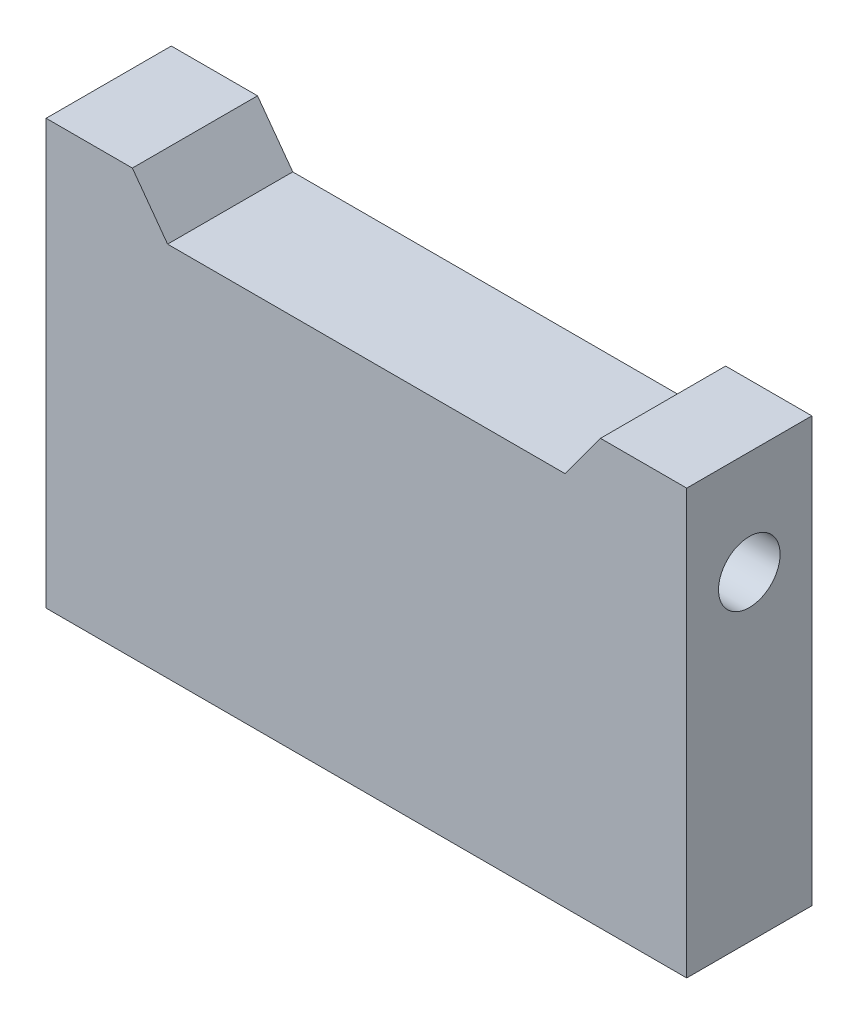
ISO-10303-21;
HEADER;
FILE_DESCRIPTION(('STEP AP214'),'2;1');
FILE_NAME('part.step','',(''),(''),'','','');
FILE_SCHEMA(('AUTOMOTIVE_DESIGN { 1 0 10303 214 1 1 1 1 }'));
ENDSEC;
DATA;
#1=APPLICATION_CONTEXT('core data for automotive mechanical design processes');
#2=APPLICATION_PROTOCOL_DEFINITION('international standard','automotive_design',2000,#1);
#3=PRODUCT_CONTEXT('',#1,'mechanical');
#4=PRODUCT('Part','Part','',(#3));
#5=PRODUCT_RELATED_PRODUCT_CATEGORY('part','',(#4));
#6=PRODUCT_DEFINITION_FORMATION('','',#4);
#7=PRODUCT_DEFINITION_CONTEXT('part definition',#1,'design');
#8=PRODUCT_DEFINITION('design','',#6,#7);
#9=PRODUCT_DEFINITION_SHAPE('','',#8);
#10=(LENGTH_UNIT() NAMED_UNIT(*) SI_UNIT(.MILLI.,.METRE.));
#11=(NAMED_UNIT(*) PLANE_ANGLE_UNIT() SI_UNIT($,.RADIAN.));
#12=(NAMED_UNIT(*) SI_UNIT($,.STERADIAN.) SOLID_ANGLE_UNIT());
#13=UNCERTAINTY_MEASURE_WITH_UNIT(LENGTH_MEASURE(1.E-05),#10,'distance_accuracy_value','');
#14=(GEOMETRIC_REPRESENTATION_CONTEXT(3) GLOBAL_UNCERTAINTY_ASSIGNED_CONTEXT((#13)) GLOBAL_UNIT_ASSIGNED_CONTEXT((#10,
#11,#12)) REPRESENTATION_CONTEXT('',''));
#15=CARTESIAN_POINT('',(0.,0.,0.));
#16=DIRECTION('',(0.,0.,1.));
#17=DIRECTION('',(1.,0.,0.));
#18=AXIS2_PLACEMENT_3D('',#15,#16,#17);
#19=CARTESIAN_POINT('',(-13.,8.61,-5.08));
#20=DIRECTION('',(0.,1.,0.));
#21=DIRECTION('',(0.,0.,1.));
#22=AXIS2_PLACEMENT_3D('',#19,#20,#21);
#23=PLANE('',#22);
#24=DIRECTION('',(0.,0.,1.));
#25=VECTOR('',#24,1.);
#26=CARTESIAN_POINT('',(-9.49999999999999,8.60999999999999,-5.08));
#27=LINE('',#26,#25);
#28=CARTESIAN_POINT('',(-9.49999999999999,8.60999999999999,-5.08));
#29=VERTEX_POINT('',#28);
#30=CARTESIAN_POINT('',(-9.49999999999999,8.60999999999999,0.));
#31=VERTEX_POINT('',#30);
#32=EDGE_CURVE('E170',#29,#31,#27,.T.);
#33=ORIENTED_EDGE('',*,*,#32,.F.);
#34=DIRECTION('',(-1.,0.,0.));
#35=VECTOR('',#34,1.);
#36=CARTESIAN_POINT('',(-13.,8.61,-5.08));
#37=LINE('',#36,#35);
#38=CARTESIAN_POINT('',(-13.,8.61,-5.08));
#39=VERTEX_POINT('',#38);
#40=EDGE_CURVE('E181',#29,#39,#37,.T.);
#41=ORIENTED_EDGE('',*,*,#40,.T.);
#42=DIRECTION('',(0.,0.,1.));
#43=VECTOR('',#42,1.);
#44=CARTESIAN_POINT('',(-13.,8.61,-5.08));
#45=LINE('',#44,#43);
#46=CARTESIAN_POINT('',(-13.,8.61,0.));
#47=VERTEX_POINT('',#46);
#48=EDGE_CURVE('E201',#39,#47,#45,.T.);
#49=ORIENTED_EDGE('',*,*,#48,.T.);
#50=DIRECTION('',(-1.,0.,0.));
#51=VECTOR('',#50,1.);
#52=CARTESIAN_POINT('',(-13.,8.61,0.));
#53=LINE('',#52,#51);
#54=EDGE_CURVE('E192',#31,#47,#53,.T.);
#55=ORIENTED_EDGE('',*,*,#54,.F.);
#56=EDGE_LOOP('',(#33,#41,#49,#55));
#57=FACE_BOUND('',#56,.T.);
#58=ADVANCED_FACE('F38',(#57),#23,.T.);
#59=CARTESIAN_POINT('',(13.,-8.61,-5.08));
#60=DIRECTION('',(1.,0.,0.));
#61=DIRECTION('',(0.,0.,-1.));
#62=AXIS2_PLACEMENT_3D('',#59,#60,#61);
#63=PLANE('',#62);
#64=CARTESIAN_POINT('',(13.,4.39,-2.54));
#65=DIRECTION('',(1.,0.,0.));
#66=DIRECTION('',(0.,0.,-1.));
#67=AXIS2_PLACEMENT_3D('',#64,#65,#66);
#68=CIRCLE('',#67,1.24999999999999);
#69=CARTESIAN_POINT('',(13.,4.39,-3.78999999999999));
#70=VERTEX_POINT('',#69);
#71=EDGE_CURVE('E132',#70,#70,#68,.T.);
#72=ORIENTED_EDGE('',*,*,#71,.F.);
#73=EDGE_LOOP('',(#72));
#74=FACE_BOUND('',#73,.T.);
#75=DIRECTION('',(0.,1.,0.));
#76=VECTOR('',#75,1.);
#77=CARTESIAN_POINT('',(13.,-8.61,0.));
#78=LINE('',#77,#76);
#79=CARTESIAN_POINT('',(13.,-8.61,0.));
#80=VERTEX_POINT('',#79);
#81=CARTESIAN_POINT('',(13.,8.61,0.));
#82=VERTEX_POINT('',#81);
#83=EDGE_CURVE('E172',#80,#82,#78,.T.);
#84=ORIENTED_EDGE('',*,*,#83,.F.);
#85=DIRECTION('',(0.,0.,1.));
#86=VECTOR('',#85,1.);
#87=CARTESIAN_POINT('',(13.,-8.61,-5.08));
#88=LINE('',#87,#86);
#89=CARTESIAN_POINT('',(13.,-8.61,-5.08));
#90=VERTEX_POINT('',#89);
#91=EDGE_CURVE('E11',#90,#80,#88,.T.);
#92=ORIENTED_EDGE('',*,*,#91,.F.);
#93=DIRECTION('',(0.,1.,0.));
#94=VECTOR('',#93,1.);
#95=CARTESIAN_POINT('',(13.,-8.61,-5.08));
#96=LINE('',#95,#94);
#97=CARTESIAN_POINT('',(13.,8.61,-5.08));
#98=VERTEX_POINT('',#97);
#99=EDGE_CURVE('E179',#90,#98,#96,.T.);
#100=ORIENTED_EDGE('',*,*,#99,.T.);
#101=DIRECTION('',(0.,0.,1.));
#102=VECTOR('',#101,1.);
#103=CARTESIAN_POINT('',(13.,8.61,-5.08));
#104=LINE('',#103,#102);
#105=EDGE_CURVE('E42',#98,#82,#104,.T.);
#106=ORIENTED_EDGE('',*,*,#105,.T.);
#107=EDGE_LOOP('',(#84,#92,#100,#106));
#108=FACE_BOUND('',#107,.T.);
#109=ADVANCED_FACE('F40',(#74,#108),#63,.T.);
#110=CARTESIAN_POINT('',(-13.,-8.61,-5.08));
#111=DIRECTION('',(0.,-1.,0.));
#112=DIRECTION('',(0.,0.,-1.));
#113=AXIS2_PLACEMENT_3D('',#110,#111,#112);
#114=PLANE('',#113);
#115=CARTESIAN_POINT('',(-10.,-8.61,-2.54));
#116=DIRECTION('',(0.,-1.,0.));
#117=DIRECTION('',(0.,0.,-1.));
#118=AXIS2_PLACEMENT_3D('',#115,#116,#117);
#119=CIRCLE('',#118,1.24999999999999);
#120=CARTESIAN_POINT('',(-10.,-8.61,-3.78999999999999));
#121=VERTEX_POINT('',#120);
#122=EDGE_CURVE('E142',#121,#121,#119,.T.);
#123=ORIENTED_EDGE('',*,*,#122,.F.);
#124=EDGE_LOOP('',(#123));
#125=FACE_BOUND('',#124,.T.);
#126=CARTESIAN_POINT('',(10.,-8.61,-2.54));
#127=DIRECTION('',(0.,-1.,0.));
#128=DIRECTION('',(0.,0.,-1.));
#129=AXIS2_PLACEMENT_3D('',#126,#127,#128);
#130=CIRCLE('',#129,1.24999999999999);
#131=CARTESIAN_POINT('',(10.,-8.61,-3.78999999999999));
#132=VERTEX_POINT('',#131);
#133=EDGE_CURVE('E148',#132,#132,#130,.T.);
#134=ORIENTED_EDGE('',*,*,#133,.F.);
#135=EDGE_LOOP('',(#134));
#136=FACE_BOUND('',#135,.T.);
#137=DIRECTION('',(1.,0.,0.));
#138=VECTOR('',#137,1.);
#139=CARTESIAN_POINT('',(-13.,-8.61,0.));
#140=LINE('',#139,#138);
#141=CARTESIAN_POINT('',(-13.,-8.61,0.));
#142=VERTEX_POINT('',#141);
#143=EDGE_CURVE('E182',#142,#80,#140,.T.);
#144=ORIENTED_EDGE('',*,*,#143,.F.);
#145=DIRECTION('',(0.,0.,1.));
#146=VECTOR('',#145,1.);
#147=CARTESIAN_POINT('',(-13.,-8.61,-5.08));
#148=LINE('',#147,#146);
#149=CARTESIAN_POINT('',(-13.,-8.61,-5.08));
#150=VERTEX_POINT('',#149);
#151=EDGE_CURVE('E47',#150,#142,#148,.T.);
#152=ORIENTED_EDGE('',*,*,#151,.F.);
#153=DIRECTION('',(1.,0.,0.));
#154=VECTOR('',#153,1.);
#155=CARTESIAN_POINT('',(-13.,-8.61,-5.08));
#156=LINE('',#155,#154);
#157=EDGE_CURVE('E188',#150,#90,#156,.T.);
#158=ORIENTED_EDGE('',*,*,#157,.T.);
#159=ORIENTED_EDGE('',*,*,#91,.T.);
#160=EDGE_LOOP('',(#144,#152,#158,#159));
#161=FACE_BOUND('',#160,.T.);
#162=ADVANCED_FACE('F212',(#125,#136,#161),#114,.T.);
#163=CARTESIAN_POINT('',(-13.,-8.61,-5.08));
#164=DIRECTION('',(-1.,0.,0.));
#165=DIRECTION('',(0.,0.,1.));
#166=AXIS2_PLACEMENT_3D('',#163,#164,#165);
#167=PLANE('',#166);
#168=CARTESIAN_POINT('',(-13.,4.39,-2.54));
#169=DIRECTION('',(-1.,0.,0.));
#170=DIRECTION('',(0.,0.,1.));
#171=AXIS2_PLACEMENT_3D('',#168,#169,#170);
#172=CIRCLE('',#171,1.24999999999999);
#173=CARTESIAN_POINT('',(-13.,4.39,-1.29000000000001));
#174=VERTEX_POINT('',#173);
#175=EDGE_CURVE('E131',#174,#174,#172,.T.);
#176=ORIENTED_EDGE('',*,*,#175,.F.);
#177=EDGE_LOOP('',(#176));
#178=FACE_BOUND('',#177,.T.);
#179=DIRECTION('',(0.,-1.,0.));
#180=VECTOR('',#179,1.);
#181=CARTESIAN_POINT('',(-13.,-8.61,0.));
#182=LINE('',#181,#180);
#183=EDGE_CURVE('E196',#47,#142,#182,.T.);
#184=ORIENTED_EDGE('',*,*,#183,.F.);
#185=ORIENTED_EDGE('',*,*,#48,.F.);
#186=DIRECTION('',(0.,-1.,0.));
#187=VECTOR('',#186,1.);
#188=CARTESIAN_POINT('',(-13.,-8.61,-5.08));
#189=LINE('',#188,#187);
#190=EDGE_CURVE('E185',#39,#150,#189,.T.);
#191=ORIENTED_EDGE('',*,*,#190,.T.);
#192=ORIENTED_EDGE('',*,*,#151,.T.);
#193=EDGE_LOOP('',(#184,#185,#191,#192));
#194=FACE_BOUND('',#193,.T.);
#195=ADVANCED_FACE('F216',(#178,#194),#167,.T.);
#196=DIRECTION('',(0.,0.,1.));
#197=VECTOR('',#196,1.);
#198=CARTESIAN_POINT('',(9.49999999999999,8.60999999999999,-5.08));
#199=LINE('',#198,#197);
#200=CARTESIAN_POINT('',(9.49999999999999,8.60999999999999,-5.08));
#201=VERTEX_POINT('',#200);
#202=CARTESIAN_POINT('',(9.49999999999999,8.60999999999999,0.));
#203=VERTEX_POINT('',#202);
#204=EDGE_CURVE('E173',#201,#203,#199,.T.);
#205=ORIENTED_EDGE('',*,*,#204,.T.);
#206=EDGE_CURVE('E193',#82,#203,#53,.T.);
#207=ORIENTED_EDGE('',*,*,#206,.F.);
#208=ORIENTED_EDGE('',*,*,#105,.F.);
#209=EDGE_CURVE('E183',#98,#201,#37,.T.);
#210=ORIENTED_EDGE('',*,*,#209,.T.);
#211=EDGE_LOOP('',(#205,#207,#208,#210));
#212=FACE_BOUND('',#211,.T.);
#213=ADVANCED_FACE('F207',(#212),#23,.T.);
#214=CARTESIAN_POINT('',(0.,0.,-5.08));
#215=DIRECTION('',(0.,0.,-1.));
#216=DIRECTION('',(-1.,0.,0.));
#217=AXIS2_PLACEMENT_3D('',#214,#215,#216);
#218=PLANE('',#217);
#219=DIRECTION('',(0.589396378844973,-0.807843987787514,0.));
#220=VECTOR('',#219,1.);
#221=CARTESIAN_POINT('',(-9.49999999999999,8.60999999999999,-5.08));
#222=LINE('',#221,#220);
#223=CARTESIAN_POINT('',(-8.06999999999999,6.65,-5.08));
#224=VERTEX_POINT('',#223);
#225=EDGE_CURVE('E154',#29,#224,#222,.T.);
#226=ORIENTED_EDGE('',*,*,#225,.T.);
#227=DIRECTION('',(1.,0.,0.));
#228=VECTOR('',#227,1.);
#229=CARTESIAN_POINT('',(-8.06999999999999,6.65,-5.08));
#230=LINE('',#229,#228);
#231=CARTESIAN_POINT('',(8.06999999999999,6.65,-5.08));
#232=VERTEX_POINT('',#231);
#233=EDGE_CURVE('E157',#224,#232,#230,.T.);
#234=ORIENTED_EDGE('',*,*,#233,.T.);
#235=DIRECTION('',(0.589396378844973,0.807843987787514,0.));
#236=VECTOR('',#235,1.);
#237=CARTESIAN_POINT('',(9.49999999999999,8.60999999999999,-5.08));
#238=LINE('',#237,#236);
#239=EDGE_CURVE('E161',#232,#201,#238,.T.);
#240=ORIENTED_EDGE('',*,*,#239,.T.);
#241=ORIENTED_EDGE('',*,*,#209,.F.);
#242=ORIENTED_EDGE('',*,*,#99,.F.);
#243=ORIENTED_EDGE('',*,*,#157,.F.);
#244=ORIENTED_EDGE('',*,*,#190,.F.);
#245=ORIENTED_EDGE('',*,*,#40,.F.);
#246=EDGE_LOOP('',(#226,#234,#240,#241,#242,#243,#244,#245));
#247=FACE_BOUND('',#246,.T.);
#248=ADVANCED_FACE('F219',(#247),#218,.T.);
#249=CARTESIAN_POINT('',(0.,0.,0.));
#250=DIRECTION('',(0.,0.,-1.));
#251=DIRECTION('',(-1.,0.,0.));
#252=AXIS2_PLACEMENT_3D('',#249,#250,#251);
#253=PLANE('',#252);
#254=DIRECTION('',(1.,0.,0.));
#255=VECTOR('',#254,1.);
#256=CARTESIAN_POINT('',(-8.06999999999999,6.65,0.));
#257=LINE('',#256,#255);
#258=CARTESIAN_POINT('',(-8.06999999999999,6.65,0.));
#259=VERTEX_POINT('',#258);
#260=CARTESIAN_POINT('',(8.06999999999999,6.65,0.));
#261=VERTEX_POINT('',#260);
#262=EDGE_CURVE('E166',#259,#261,#257,.T.);
#263=ORIENTED_EDGE('',*,*,#262,.F.);
#264=DIRECTION('',(0.589396378844973,-0.807843987787514,0.));
#265=VECTOR('',#264,1.);
#266=CARTESIAN_POINT('',(-9.49999999999999,8.60999999999999,0.));
#267=LINE('',#266,#265);
#268=EDGE_CURVE('E55',#31,#259,#267,.T.);
#269=ORIENTED_EDGE('',*,*,#268,.F.);
#270=ORIENTED_EDGE('',*,*,#54,.T.);
#271=ORIENTED_EDGE('',*,*,#183,.T.);
#272=ORIENTED_EDGE('',*,*,#143,.T.);
#273=ORIENTED_EDGE('',*,*,#83,.T.);
#274=ORIENTED_EDGE('',*,*,#206,.T.);
#275=DIRECTION('',(0.589396378844973,0.807843987787514,0.));
#276=VECTOR('',#275,1.);
#277=CARTESIAN_POINT('',(9.49999999999999,8.60999999999999,0.));
#278=LINE('',#277,#276);
#279=EDGE_CURVE('E158',#261,#203,#278,.T.);
#280=ORIENTED_EDGE('',*,*,#279,.F.);
#281=EDGE_LOOP('',(#263,#269,#270,#271,#272,#273,#274,#280));
#282=FACE_BOUND('',#281,.T.);
#283=ADVANCED_FACE('F211',(#282),#253,.F.);
#284=CARTESIAN_POINT('',(-9.49999999999999,8.60999999999999,-5.08));
#285=DIRECTION('',(-0.807843987787514,-0.589396378844973,0.));
#286=DIRECTION('',(0.589396378844973,-0.807843987787514,0.));
#287=AXIS2_PLACEMENT_3D('',#284,#285,#286);
#288=PLANE('',#287);
#289=ORIENTED_EDGE('',*,*,#268,.T.);
#290=DIRECTION('',(0.,0.,1.));
#291=VECTOR('',#290,1.);
#292=CARTESIAN_POINT('',(-8.06999999999999,6.65,-5.08));
#293=LINE('',#292,#291);
#294=EDGE_CURVE('E164',#224,#259,#293,.T.);
#295=ORIENTED_EDGE('',*,*,#294,.F.);
#296=ORIENTED_EDGE('',*,*,#225,.F.);
#297=ORIENTED_EDGE('',*,*,#32,.T.);
#298=EDGE_LOOP('',(#289,#295,#296,#297));
#299=FACE_BOUND('',#298,.T.);
#300=ADVANCED_FACE('F226',(#299),#288,.F.);
#301=CARTESIAN_POINT('',(9.49999999999999,8.60999999999999,-5.08));
#302=DIRECTION('',(0.807843987787514,-0.589396378844973,0.));
#303=DIRECTION('',(0.589396378844973,0.807843987787514,0.));
#304=AXIS2_PLACEMENT_3D('',#301,#302,#303);
#305=PLANE('',#304);
#306=ORIENTED_EDGE('',*,*,#279,.T.);
#307=ORIENTED_EDGE('',*,*,#204,.F.);
#308=ORIENTED_EDGE('',*,*,#239,.F.);
#309=DIRECTION('',(0.,0.,1.));
#310=VECTOR('',#309,1.);
#311=CARTESIAN_POINT('',(8.06999999999999,6.65,-5.08));
#312=LINE('',#311,#310);
#313=EDGE_CURVE('E176',#232,#261,#312,.T.);
#314=ORIENTED_EDGE('',*,*,#313,.T.);
#315=EDGE_LOOP('',(#306,#307,#308,#314));
#316=FACE_BOUND('',#315,.T.);
#317=ADVANCED_FACE('F223',(#316),#305,.F.);
#318=CARTESIAN_POINT('',(-8.06999999999999,6.65,-5.08));
#319=DIRECTION('',(0.,-1.,0.));
#320=DIRECTION('',(1.,0.,0.));
#321=AXIS2_PLACEMENT_3D('',#318,#319,#320);
#322=PLANE('',#321);
#323=ORIENTED_EDGE('',*,*,#262,.T.);
#324=ORIENTED_EDGE('',*,*,#313,.F.);
#325=ORIENTED_EDGE('',*,*,#233,.F.);
#326=ORIENTED_EDGE('',*,*,#294,.T.);
#327=EDGE_LOOP('',(#323,#324,#325,#326));
#328=FACE_BOUND('',#327,.T.);
#329=ADVANCED_FACE('F225',(#328),#322,.F.);
#330=CARTESIAN_POINT('',(10.,-0.609999999999999,-2.54));
#331=DIRECTION('',(0.,-1.,0.));
#332=DIRECTION('',(0.,0.,-1.));
#333=AXIS2_PLACEMENT_3D('',#330,#331,#332);
#334=CONICAL_SURFACE('',#333,1.25,1.02974425867665);
#335=CARTESIAN_POINT('',(10.,0.141075773784452,-2.54));
#336=VERTEX_POINT('',#335);
#337=VERTEX_LOOP('',#336);
#338=FACE_BOUND('',#337,.T.);
#339=CARTESIAN_POINT('',(10.,-0.609999999999999,-2.54));
#340=DIRECTION('',(0.,-1.,0.));
#341=DIRECTION('',(0.,0.,-1.));
#342=AXIS2_PLACEMENT_3D('',#339,#340,#341);
#343=CIRCLE('',#342,1.25);
#344=CARTESIAN_POINT('',(10.,-0.609999999999999,-3.79));
#345=VERTEX_POINT('',#344);
#346=EDGE_CURVE('E151',#345,#345,#343,.T.);
#347=ORIENTED_EDGE('',*,*,#346,.T.);
#348=EDGE_LOOP('',(#347));
#349=FACE_BOUND('',#348,.T.);
#350=ADVANCED_FACE('F254',(#338,#349),#334,.F.);
#351=CARTESIAN_POINT('',(10.,-8.61,-2.54));
#352=DIRECTION('',(0.,-1.,0.));
#353=DIRECTION('',(0.,0.,-1.));
#354=AXIS2_PLACEMENT_3D('',#351,#352,#353);
#355=CYLINDRICAL_SURFACE('',#354,1.24999999999999);
#356=ORIENTED_EDGE('',*,*,#346,.F.);
#357=EDGE_LOOP('',(#356));
#358=FACE_BOUND('',#357,.T.);
#359=ORIENTED_EDGE('',*,*,#133,.T.);
#360=EDGE_LOOP('',(#359));
#361=FACE_BOUND('',#360,.T.);
#362=ADVANCED_FACE('F259',(#358,#361),#355,.F.);
#363=CARTESIAN_POINT('',(-10.,-0.609999999999999,-2.54));
#364=DIRECTION('',(0.,-1.,0.));
#365=DIRECTION('',(0.,0.,-1.));
#366=AXIS2_PLACEMENT_3D('',#363,#364,#365);
#367=CONICAL_SURFACE('',#366,1.25,1.02974425867665);
#368=CARTESIAN_POINT('',(-10.,0.141075773784452,-2.54));
#369=VERTEX_POINT('',#368);
#370=VERTEX_LOOP('',#369);
#371=FACE_BOUND('',#370,.T.);
#372=CARTESIAN_POINT('',(-10.,-0.609999999999999,-2.54));
#373=DIRECTION('',(0.,-1.,0.));
#374=DIRECTION('',(0.,0.,-1.));
#375=AXIS2_PLACEMENT_3D('',#372,#373,#374);
#376=CIRCLE('',#375,1.25);
#377=CARTESIAN_POINT('',(-10.,-0.609999999999999,-3.79));
#378=VERTEX_POINT('',#377);
#379=EDGE_CURVE('E145',#378,#378,#376,.T.);
#380=ORIENTED_EDGE('',*,*,#379,.T.);
#381=EDGE_LOOP('',(#380));
#382=FACE_BOUND('',#381,.T.);
#383=ADVANCED_FACE('F263',(#371,#382),#367,.F.);
#384=CARTESIAN_POINT('',(-10.,-8.61,-2.54));
#385=DIRECTION('',(0.,-1.,0.));
#386=DIRECTION('',(0.,0.,-1.));
#387=AXIS2_PLACEMENT_3D('',#384,#385,#386);
#388=CYLINDRICAL_SURFACE('',#387,1.24999999999999);
#389=ORIENTED_EDGE('',*,*,#379,.F.);
#390=EDGE_LOOP('',(#389));
#391=FACE_BOUND('',#390,.T.);
#392=ORIENTED_EDGE('',*,*,#122,.T.);
#393=EDGE_LOOP('',(#392));
#394=FACE_BOUND('',#393,.T.);
#395=ADVANCED_FACE('F267',(#391,#394),#388,.F.);
#396=CARTESIAN_POINT('',(-7.,4.39,-2.54));
#397=DIRECTION('',(-1.,0.,0.));
#398=DIRECTION('',(0.,0.,1.));
#399=AXIS2_PLACEMENT_3D('',#396,#397,#398);
#400=CONICAL_SURFACE('',#399,1.25,1.02974425867665);
#401=CARTESIAN_POINT('',(-6.24892422621555,4.39,-2.54));
#402=VERTEX_POINT('',#401);
#403=VERTEX_LOOP('',#402);
#404=FACE_BOUND('',#403,.T.);
#405=CARTESIAN_POINT('',(-7.,4.39,-2.54));
#406=DIRECTION('',(-1.,0.,0.));
#407=DIRECTION('',(0.,0.,1.));
#408=AXIS2_PLACEMENT_3D('',#405,#406,#407);
#409=CIRCLE('',#408,1.25);
#410=CARTESIAN_POINT('',(-7.,4.39,-1.29));
#411=VERTEX_POINT('',#410);
#412=EDGE_CURVE('E135',#411,#411,#409,.T.);
#413=ORIENTED_EDGE('',*,*,#412,.T.);
#414=EDGE_LOOP('',(#413));
#415=FACE_BOUND('',#414,.T.);
#416=ADVANCED_FACE('F271',(#404,#415),#400,.F.);
#417=CARTESIAN_POINT('',(-13.,4.39,-2.54));
#418=DIRECTION('',(-1.,0.,0.));
#419=DIRECTION('',(0.,0.,1.));
#420=AXIS2_PLACEMENT_3D('',#417,#418,#419);
#421=CYLINDRICAL_SURFACE('',#420,1.24999999999999);
#422=ORIENTED_EDGE('',*,*,#412,.F.);
#423=EDGE_LOOP('',(#422));
#424=FACE_BOUND('',#423,.T.);
#425=ORIENTED_EDGE('',*,*,#175,.T.);
#426=EDGE_LOOP('',(#425));
#427=FACE_BOUND('',#426,.T.);
#428=ADVANCED_FACE('F125',(#424,#427),#421,.F.);
#429=CARTESIAN_POINT('',(7.,4.39,-2.54));
#430=DIRECTION('',(1.,0.,0.));
#431=DIRECTION('',(0.,0.,-1.));
#432=AXIS2_PLACEMENT_3D('',#429,#430,#431);
#433=CONICAL_SURFACE('',#432,1.25,1.02974425867665);
#434=CARTESIAN_POINT('',(6.24892422621555,4.39,-2.54));
#435=VERTEX_POINT('',#434);
#436=VERTEX_LOOP('',#435);
#437=FACE_BOUND('',#436,.T.);
#438=CARTESIAN_POINT('',(7.,4.39,-2.54));
#439=DIRECTION('',(1.,0.,0.));
#440=DIRECTION('',(0.,0.,-1.));
#441=AXIS2_PLACEMENT_3D('',#438,#439,#440);
#442=CIRCLE('',#441,1.25);
#443=CARTESIAN_POINT('',(7.,4.39,-3.79));
#444=VERTEX_POINT('',#443);
#445=EDGE_CURVE('E129',#444,#444,#442,.T.);
#446=ORIENTED_EDGE('',*,*,#445,.T.);
#447=EDGE_LOOP('',(#446));
#448=FACE_BOUND('',#447,.T.);
#449=ADVANCED_FACE('F121',(#437,#448),#433,.F.);
#450=CARTESIAN_POINT('',(13.,4.39,-2.54));
#451=DIRECTION('',(1.,0.,0.));
#452=DIRECTION('',(0.,0.,-1.));
#453=AXIS2_PLACEMENT_3D('',#450,#451,#452);
#454=CYLINDRICAL_SURFACE('',#453,1.24999999999999);
#455=ORIENTED_EDGE('',*,*,#445,.F.);
#456=EDGE_LOOP('',(#455));
#457=FACE_BOUND('',#456,.T.);
#458=ORIENTED_EDGE('',*,*,#71,.T.);
#459=EDGE_LOOP('',(#458));
#460=FACE_BOUND('',#459,.T.);
#461=ADVANCED_FACE('F124',(#457,#460),#454,.F.);
#462=CLOSED_SHELL('',(#58,#109,#162,#195,#213,#248,#283,#300,#317,#329,#350,#362,#383,#395,#416,
#428,#449,#461));
#463=MANIFOLD_SOLID_BREP('B2',#462);
#464=ADVANCED_BREP_SHAPE_REPRESENTATION('',(#18,#463),#14);
#465=SHAPE_DEFINITION_REPRESENTATION(#9,#464);
ENDSEC;
END-ISO-10303-21;
